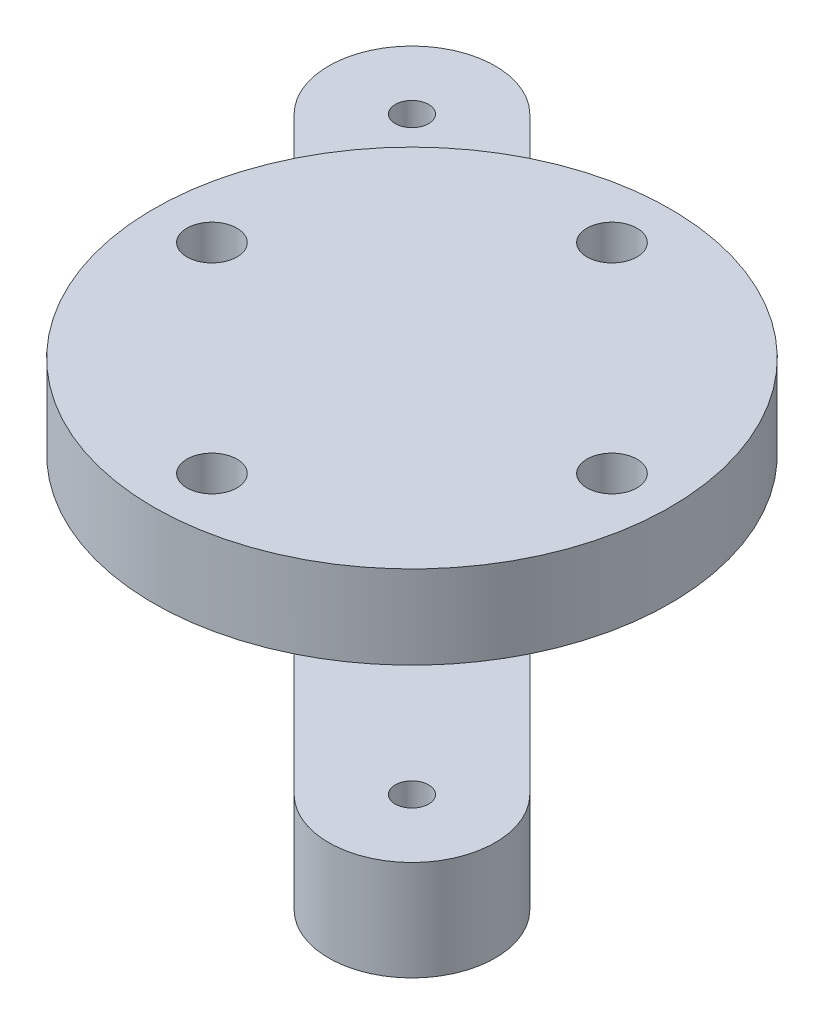
ISO-10303-21;
HEADER;
FILE_DESCRIPTION(('STEP AP214'),'2;1');
FILE_NAME('part.step','',(''),(''),'','','');
FILE_SCHEMA(('AUTOMOTIVE_DESIGN { 1 0 10303 214 1 1 1 1 }'));
ENDSEC;
DATA;
#1=APPLICATION_CONTEXT('core data for automotive mechanical design processes');
#2=APPLICATION_PROTOCOL_DEFINITION('international standard','automotive_design',2000,#1);
#3=PRODUCT_CONTEXT('',#1,'mechanical');
#4=PRODUCT('Part','Part','',(#3));
#5=PRODUCT_RELATED_PRODUCT_CATEGORY('part','',(#4));
#6=PRODUCT_DEFINITION_FORMATION('','',#4);
#7=PRODUCT_DEFINITION_CONTEXT('part definition',#1,'design');
#8=PRODUCT_DEFINITION('design','',#6,#7);
#9=PRODUCT_DEFINITION_SHAPE('','',#8);
#10=(LENGTH_UNIT() NAMED_UNIT(*) SI_UNIT(.MILLI.,.METRE.));
#11=(NAMED_UNIT(*) PLANE_ANGLE_UNIT() SI_UNIT($,.RADIAN.));
#12=(NAMED_UNIT(*) SI_UNIT($,.STERADIAN.) SOLID_ANGLE_UNIT());
#13=UNCERTAINTY_MEASURE_WITH_UNIT(LENGTH_MEASURE(1.E-05),#10,'distance_accuracy_value','');
#14=(GEOMETRIC_REPRESENTATION_CONTEXT(3) GLOBAL_UNCERTAINTY_ASSIGNED_CONTEXT((#13)) GLOBAL_UNIT_ASSIGNED_CONTEXT((#10,
#11,#12)) REPRESENTATION_CONTEXT('',''));
#15=CARTESIAN_POINT('',(0.,0.,0.));
#16=DIRECTION('',(0.,0.,1.));
#17=DIRECTION('',(1.,0.,0.));
#18=AXIS2_PLACEMENT_3D('',#15,#16,#17);
#19=CARTESIAN_POINT('',(0.,0.,0.));
#20=DIRECTION('',(0.,1.,0.));
#21=DIRECTION('',(0.,0.,1.));
#22=AXIS2_PLACEMENT_3D('',#19,#20,#21);
#23=PLANE('',#22);
#24=CARTESIAN_POINT('',(0.,0.,-24.));
#25=DIRECTION('',(0.,1.,0.));
#26=DIRECTION('',(0.,0.,1.));
#27=AXIS2_PLACEMENT_3D('',#24,#25,#26);
#28=CIRCLE('',#27,5.);
#29=CARTESIAN_POINT('',(0.,0.,-19.));
#30=VERTEX_POINT('',#29);
#31=EDGE_CURVE('E184',#30,#30,#28,.T.);
#32=ORIENTED_EDGE('',*,*,#31,.T.);
#33=EDGE_LOOP('',(#32));
#34=FACE_BOUND('',#33,.T.);
#35=CARTESIAN_POINT('',(24.,0.,0.));
#36=DIRECTION('',(0.,1.,0.));
#37=DIRECTION('',(0.,0.,1.));
#38=AXIS2_PLACEMENT_3D('',#35,#36,#37);
#39=CIRCLE('',#38,5.);
#40=CARTESIAN_POINT('',(24.,0.,5.));
#41=VERTEX_POINT('',#40);
#42=EDGE_CURVE('E176',#41,#41,#39,.T.);
#43=ORIENTED_EDGE('',*,*,#42,.T.);
#44=EDGE_LOOP('',(#43));
#45=FACE_BOUND('',#44,.T.);
#46=CARTESIAN_POINT('',(0.,0.,0.));
#47=DIRECTION('',(0.,1.,0.));
#48=DIRECTION('',(0.,0.,1.));
#49=AXIS2_PLACEMENT_3D('',#46,#47,#48);
#50=CIRCLE('',#49,31.);
#51=CARTESIAN_POINT('',(27.8195617331119,0.,13.677426109381));
#52=VERTEX_POINT('',#51);
#53=CARTESIAN_POINT('',(-13.6774261093809,0.,-27.8195617331119));
#54=VERTEX_POINT('',#53);
#55=EDGE_CURVE('E216',#52,#54,#50,.T.);
#56=ORIENTED_EDGE('',*,*,#55,.F.);
#57=DIRECTION('',(-0.707106781186547,0.,-0.707106781186547));
#58=VECTOR('',#57,1.);
#59=CARTESIAN_POINT('',(42.4264068711928,0.,28.2842712474619));
#60=LINE('',#59,#58);
#61=EDGE_CURVE('E11',#52,#54,#60,.T.);
#62=ORIENTED_EDGE('',*,*,#61,.T.);
#63=EDGE_LOOP('',(#56,#62));
#64=FACE_BOUND('',#63,.T.);
#65=ADVANCED_FACE('F45',(#34,#45,#64),#23,.F.);
#66=CARTESIAN_POINT('',(0.,10.,0.));
#67=DIRECTION('',(0.,-1.,0.));
#68=DIRECTION('',(0.,0.,-1.));
#69=AXIS2_PLACEMENT_3D('',#66,#67,#68);
#70=CYLINDRICAL_SURFACE('',#69,31.);
#71=CARTESIAN_POINT('',(0.,10.,0.));
#72=DIRECTION('',(0.,1.,0.));
#73=DIRECTION('',(0.,0.,1.));
#74=AXIS2_PLACEMENT_3D('',#71,#72,#73);
#75=CIRCLE('',#74,31.);
#76=CARTESIAN_POINT('',(0.,10.,31.));
#77=VERTEX_POINT('',#76);
#78=EDGE_CURVE('E208',#77,#77,#75,.T.);
#79=ORIENTED_EDGE('',*,*,#78,.F.);
#80=EDGE_LOOP('',(#79));
#81=FACE_BOUND('',#80,.T.);
#82=CARTESIAN_POINT('',(13.6774261093809,0.,27.8195617331119));
#83=VERTEX_POINT('',#82);
#84=EDGE_CURVE('E212',#83,#52,#50,.T.);
#85=ORIENTED_EDGE('',*,*,#84,.T.);
#86=ORIENTED_EDGE('',*,*,#55,.T.);
#87=CARTESIAN_POINT('',(-27.819561733112,0.,-13.6774261093808));
#88=VERTEX_POINT('',#87);
#89=EDGE_CURVE('E282',#54,#88,#50,.T.);
#90=ORIENTED_EDGE('',*,*,#89,.T.);
#91=EDGE_CURVE('E195',#88,#83,#50,.T.);
#92=ORIENTED_EDGE('',*,*,#91,.T.);
#93=EDGE_LOOP('',(#85,#86,#90,#92));
#94=FACE_BOUND('',#93,.T.);
#95=ADVANCED_FACE('F47',(#81,#94),#70,.T.);
#96=CARTESIAN_POINT('',(0.,10.,0.));
#97=DIRECTION('',(0.,1.,0.));
#98=DIRECTION('',(0.,0.,1.));
#99=AXIS2_PLACEMENT_3D('',#96,#97,#98);
#100=PLANE('',#99);
#101=CARTESIAN_POINT('',(24.,10.,0.));
#102=DIRECTION('',(0.,1.,0.));
#103=DIRECTION('',(0.,0.,1.));
#104=AXIS2_PLACEMENT_3D('',#101,#102,#103);
#105=CIRCLE('',#104,2.99999999999999);
#106=CARTESIAN_POINT('',(24.,10.,2.99999999999999));
#107=VERTEX_POINT('',#106);
#108=EDGE_CURVE('E191',#107,#107,#105,.T.);
#109=ORIENTED_EDGE('',*,*,#108,.F.);
#110=EDGE_LOOP('',(#109));
#111=FACE_BOUND('',#110,.T.);
#112=CARTESIAN_POINT('',(0.,10.,24.));
#113=DIRECTION('',(0.,1.,0.));
#114=DIRECTION('',(0.,0.,1.));
#115=AXIS2_PLACEMENT_3D('',#112,#113,#114);
#116=CIRCLE('',#115,3.);
#117=CARTESIAN_POINT('',(0.,10.,27.));
#118=VERTEX_POINT('',#117);
#119=EDGE_CURVE('E196',#118,#118,#116,.T.);
#120=ORIENTED_EDGE('',*,*,#119,.F.);
#121=EDGE_LOOP('',(#120));
#122=FACE_BOUND('',#121,.T.);
#123=CARTESIAN_POINT('',(-24.,10.,0.));
#124=DIRECTION('',(0.,1.,0.));
#125=DIRECTION('',(0.,0.,1.));
#126=AXIS2_PLACEMENT_3D('',#123,#124,#125);
#127=CIRCLE('',#126,3.);
#128=CARTESIAN_POINT('',(-24.,10.,3.));
#129=VERTEX_POINT('',#128);
#130=EDGE_CURVE('E200',#129,#129,#127,.T.);
#131=ORIENTED_EDGE('',*,*,#130,.F.);
#132=EDGE_LOOP('',(#131));
#133=FACE_BOUND('',#132,.T.);
#134=CARTESIAN_POINT('',(0.,10.,-24.));
#135=DIRECTION('',(0.,1.,0.));
#136=DIRECTION('',(0.,0.,1.));
#137=AXIS2_PLACEMENT_3D('',#134,#135,#136);
#138=CIRCLE('',#137,3.);
#139=CARTESIAN_POINT('',(0.,10.,-21.));
#140=VERTEX_POINT('',#139);
#141=EDGE_CURVE('E204',#140,#140,#138,.T.);
#142=ORIENTED_EDGE('',*,*,#141,.F.);
#143=EDGE_LOOP('',(#142));
#144=FACE_BOUND('',#143,.T.);
#145=ORIENTED_EDGE('',*,*,#78,.T.);
#146=EDGE_LOOP('',(#145));
#147=FACE_BOUND('',#146,.T.);
#148=ADVANCED_FACE('F259',(#111,#122,#133,#144,#147),#100,.T.);
#149=CARTESIAN_POINT('',(-24.,0.,0.));
#150=DIRECTION('',(0.,1.,0.));
#151=DIRECTION('',(0.,0.,1.));
#152=AXIS2_PLACEMENT_3D('',#149,#150,#151);
#153=CIRCLE('',#152,5.);
#154=CARTESIAN_POINT('',(-24.,0.,5.));
#155=VERTEX_POINT('',#154);
#156=EDGE_CURVE('E164',#155,#155,#153,.T.);
#157=ORIENTED_EDGE('',*,*,#156,.T.);
#158=EDGE_LOOP('',(#157));
#159=FACE_BOUND('',#158,.T.);
#160=CARTESIAN_POINT('',(0.,0.,24.));
#161=DIRECTION('',(0.,1.,0.));
#162=DIRECTION('',(0.,0.,1.));
#163=AXIS2_PLACEMENT_3D('',#160,#161,#162);
#164=CIRCLE('',#163,5.);
#165=CARTESIAN_POINT('',(0.,0.,29.));
#166=VERTEX_POINT('',#165);
#167=EDGE_CURVE('E168',#166,#166,#164,.T.);
#168=ORIENTED_EDGE('',*,*,#167,.T.);
#169=EDGE_LOOP('',(#168));
#170=FACE_BOUND('',#169,.T.);
#171=ORIENTED_EDGE('',*,*,#91,.F.);
#172=DIRECTION('',(0.707106781186549,0.,0.707106781186546));
#173=VECTOR('',#172,1.);
#174=CARTESIAN_POINT('',(28.2842712474619,0.,42.4264068711928));
#175=LINE('',#174,#173);
#176=EDGE_CURVE('E55',#88,#83,#175,.T.);
#177=ORIENTED_EDGE('',*,*,#176,.T.);
#178=EDGE_LOOP('',(#171,#177));
#179=FACE_BOUND('',#178,.T.);
#180=ADVANCED_FACE('F255',(#159,#170,#179),#23,.F.);
#181=CARTESIAN_POINT('',(0.,0.,-24.));
#182=DIRECTION('',(0.,1.,0.));
#183=DIRECTION('',(0.,0.,1.));
#184=AXIS2_PLACEMENT_3D('',#181,#182,#183);
#185=CYLINDRICAL_SURFACE('',#184,3.);
#186=CARTESIAN_POINT('',(0.,5.,-24.));
#187=DIRECTION('',(0.,1.,0.));
#188=DIRECTION('',(0.,0.,1.));
#189=AXIS2_PLACEMENT_3D('',#186,#187,#188);
#190=CIRCLE('',#189,3.);
#191=CARTESIAN_POINT('',(0.,5.,-21.));
#192=VERTEX_POINT('',#191);
#193=EDGE_CURVE('E49',#192,#192,#190,.F.);
#194=ORIENTED_EDGE('',*,*,#193,.T.);
#195=EDGE_LOOP('',(#194));
#196=FACE_BOUND('',#195,.T.);
#197=ORIENTED_EDGE('',*,*,#141,.T.);
#198=EDGE_LOOP('',(#197));
#199=FACE_BOUND('',#198,.T.);
#200=ADVANCED_FACE('F232',(#196,#199),#185,.F.);
#201=CARTESIAN_POINT('',(-24.,0.,0.));
#202=DIRECTION('',(0.,1.,0.));
#203=DIRECTION('',(0.,0.,1.));
#204=AXIS2_PLACEMENT_3D('',#201,#202,#203);
#205=CYLINDRICAL_SURFACE('',#204,3.);
#206=CARTESIAN_POINT('',(-24.,5.,0.));
#207=DIRECTION('',(0.,1.,0.));
#208=DIRECTION('',(0.,0.,1.));
#209=AXIS2_PLACEMENT_3D('',#206,#207,#208);
#210=CIRCLE('',#209,3.);
#211=CARTESIAN_POINT('',(-24.,5.,3.));
#212=VERTEX_POINT('',#211);
#213=EDGE_CURVE('E223',#212,#212,#210,.F.);
#214=ORIENTED_EDGE('',*,*,#213,.T.);
#215=EDGE_LOOP('',(#214));
#216=FACE_BOUND('',#215,.T.);
#217=ORIENTED_EDGE('',*,*,#130,.T.);
#218=EDGE_LOOP('',(#217));
#219=FACE_BOUND('',#218,.T.);
#220=ADVANCED_FACE('F269',(#216,#219),#205,.F.);
#221=CARTESIAN_POINT('',(0.,0.,24.));
#222=DIRECTION('',(0.,1.,0.));
#223=DIRECTION('',(0.,0.,1.));
#224=AXIS2_PLACEMENT_3D('',#221,#222,#223);
#225=CYLINDRICAL_SURFACE('',#224,3.);
#226=CARTESIAN_POINT('',(0.,5.,24.));
#227=DIRECTION('',(0.,1.,0.));
#228=DIRECTION('',(0.,0.,1.));
#229=AXIS2_PLACEMENT_3D('',#226,#227,#228);
#230=CIRCLE('',#229,3.);
#231=CARTESIAN_POINT('',(0.,5.,27.));
#232=VERTEX_POINT('',#231);
#233=EDGE_CURVE('E220',#232,#232,#230,.F.);
#234=ORIENTED_EDGE('',*,*,#233,.T.);
#235=EDGE_LOOP('',(#234));
#236=FACE_BOUND('',#235,.T.);
#237=ORIENTED_EDGE('',*,*,#119,.T.);
#238=EDGE_LOOP('',(#237));
#239=FACE_BOUND('',#238,.T.);
#240=ADVANCED_FACE('F353',(#236,#239),#225,.F.);
#241=CARTESIAN_POINT('',(24.,0.,0.));
#242=DIRECTION('',(0.,1.,0.));
#243=DIRECTION('',(0.,0.,1.));
#244=AXIS2_PLACEMENT_3D('',#241,#242,#243);
#245=CYLINDRICAL_SURFACE('',#244,2.99999999999999);
#246=CARTESIAN_POINT('',(24.,5.,0.));
#247=DIRECTION('',(0.,1.,0.));
#248=DIRECTION('',(0.,0.,1.));
#249=AXIS2_PLACEMENT_3D('',#246,#247,#248);
#250=CIRCLE('',#249,2.99999999999999);
#251=CARTESIAN_POINT('',(24.,5.,2.99999999999999));
#252=VERTEX_POINT('',#251);
#253=EDGE_CURVE('E163',#252,#252,#250,.F.);
#254=ORIENTED_EDGE('',*,*,#253,.T.);
#255=EDGE_LOOP('',(#254));
#256=FACE_BOUND('',#255,.T.);
#257=ORIENTED_EDGE('',*,*,#108,.T.);
#258=EDGE_LOOP('',(#257));
#259=FACE_BOUND('',#258,.T.);
#260=ADVANCED_FACE('F348',(#256,#259),#245,.F.);
#261=CARTESIAN_POINT('',(24.,5.,0.));
#262=DIRECTION('',(0.,1.,0.));
#263=DIRECTION('',(0.,0.,1.));
#264=AXIS2_PLACEMENT_3D('',#261,#262,#263);
#265=PLANE('',#264);
#266=CARTESIAN_POINT('',(24.,5.,0.));
#267=DIRECTION('',(0.,1.,0.));
#268=DIRECTION('',(0.,0.,1.));
#269=AXIS2_PLACEMENT_3D('',#266,#267,#268);
#270=CIRCLE('',#269,5.);
#271=CARTESIAN_POINT('',(24.,5.,5.));
#272=VERTEX_POINT('',#271);
#273=EDGE_CURVE('E180',#272,#272,#270,.T.);
#274=ORIENTED_EDGE('',*,*,#273,.F.);
#275=EDGE_LOOP('',(#274));
#276=FACE_BOUND('',#275,.T.);
#277=ORIENTED_EDGE('',*,*,#253,.F.);
#278=EDGE_LOOP('',(#277));
#279=FACE_BOUND('',#278,.T.);
#280=ADVANCED_FACE('F345',(#276,#279),#265,.F.);
#281=CARTESIAN_POINT('',(24.,5.,0.));
#282=DIRECTION('',(0.,-1.,0.));
#283=DIRECTION('',(0.,0.,-1.));
#284=AXIS2_PLACEMENT_3D('',#281,#282,#283);
#285=CYLINDRICAL_SURFACE('',#284,5.);
#286=ORIENTED_EDGE('',*,*,#273,.T.);
#287=EDGE_LOOP('',(#286));
#288=FACE_BOUND('',#287,.T.);
#289=ORIENTED_EDGE('',*,*,#42,.F.);
#290=EDGE_LOOP('',(#289));
#291=FACE_BOUND('',#290,.T.);
#292=ADVANCED_FACE('F341',(#288,#291),#285,.F.);
#293=CARTESIAN_POINT('',(0.,5.,24.));
#294=DIRECTION('',(0.,1.,0.));
#295=DIRECTION('',(0.,0.,1.));
#296=AXIS2_PLACEMENT_3D('',#293,#294,#295);
#297=PLANE('',#296);
#298=CARTESIAN_POINT('',(0.,5.,24.));
#299=DIRECTION('',(0.,1.,0.));
#300=DIRECTION('',(0.,0.,1.));
#301=AXIS2_PLACEMENT_3D('',#298,#299,#300);
#302=CIRCLE('',#301,5.);
#303=CARTESIAN_POINT('',(0.,5.,29.));
#304=VERTEX_POINT('',#303);
#305=EDGE_CURVE('E172',#304,#304,#302,.T.);
#306=ORIENTED_EDGE('',*,*,#305,.F.);
#307=EDGE_LOOP('',(#306));
#308=FACE_BOUND('',#307,.T.);
#309=ORIENTED_EDGE('',*,*,#233,.F.);
#310=EDGE_LOOP('',(#309));
#311=FACE_BOUND('',#310,.T.);
#312=ADVANCED_FACE('F337',(#308,#311),#297,.F.);
#313=CARTESIAN_POINT('',(0.,5.,24.));
#314=DIRECTION('',(0.,-1.,0.));
#315=DIRECTION('',(0.,0.,-1.));
#316=AXIS2_PLACEMENT_3D('',#313,#314,#315);
#317=CYLINDRICAL_SURFACE('',#316,5.);
#318=ORIENTED_EDGE('',*,*,#305,.T.);
#319=EDGE_LOOP('',(#318));
#320=FACE_BOUND('',#319,.T.);
#321=ORIENTED_EDGE('',*,*,#167,.F.);
#322=EDGE_LOOP('',(#321));
#323=FACE_BOUND('',#322,.T.);
#324=ADVANCED_FACE('F332',(#320,#323),#317,.F.);
#325=CARTESIAN_POINT('',(-24.,5.,0.));
#326=DIRECTION('',(0.,1.,0.));
#327=DIRECTION('',(0.,0.,1.));
#328=AXIS2_PLACEMENT_3D('',#325,#326,#327);
#329=PLANE('',#328);
#330=CARTESIAN_POINT('',(-24.,5.,0.));
#331=DIRECTION('',(0.,1.,0.));
#332=DIRECTION('',(0.,0.,1.));
#333=AXIS2_PLACEMENT_3D('',#330,#331,#332);
#334=CIRCLE('',#333,5.);
#335=CARTESIAN_POINT('',(-24.,5.,5.));
#336=VERTEX_POINT('',#335);
#337=EDGE_CURVE('E159',#336,#336,#334,.T.);
#338=ORIENTED_EDGE('',*,*,#337,.F.);
#339=EDGE_LOOP('',(#338));
#340=FACE_BOUND('',#339,.T.);
#341=ORIENTED_EDGE('',*,*,#213,.F.);
#342=EDGE_LOOP('',(#341));
#343=FACE_BOUND('',#342,.T.);
#344=ADVANCED_FACE('F248',(#340,#343),#329,.F.);
#345=CARTESIAN_POINT('',(-24.,5.,0.));
#346=DIRECTION('',(0.,-1.,0.));
#347=DIRECTION('',(0.,0.,-1.));
#348=AXIS2_PLACEMENT_3D('',#345,#346,#347);
#349=CYLINDRICAL_SURFACE('',#348,5.);
#350=ORIENTED_EDGE('',*,*,#337,.T.);
#351=EDGE_LOOP('',(#350));
#352=FACE_BOUND('',#351,.T.);
#353=ORIENTED_EDGE('',*,*,#156,.F.);
#354=EDGE_LOOP('',(#353));
#355=FACE_BOUND('',#354,.T.);
#356=ADVANCED_FACE('F238',(#352,#355),#349,.F.);
#357=CARTESIAN_POINT('',(0.,5.,-24.));
#358=DIRECTION('',(0.,1.,0.));
#359=DIRECTION('',(0.,0.,1.));
#360=AXIS2_PLACEMENT_3D('',#357,#358,#359);
#361=PLANE('',#360);
#362=CARTESIAN_POINT('',(0.,5.,-24.));
#363=DIRECTION('',(0.,1.,0.));
#364=DIRECTION('',(0.,0.,1.));
#365=AXIS2_PLACEMENT_3D('',#362,#363,#364);
#366=CIRCLE('',#365,5.);
#367=CARTESIAN_POINT('',(0.,5.,-19.));
#368=VERTEX_POINT('',#367);
#369=EDGE_CURVE('E153',#368,#368,#366,.T.);
#370=ORIENTED_EDGE('',*,*,#369,.F.);
#371=EDGE_LOOP('',(#370));
#372=FACE_BOUND('',#371,.T.);
#373=ORIENTED_EDGE('',*,*,#193,.F.);
#374=EDGE_LOOP('',(#373));
#375=FACE_BOUND('',#374,.T.);
#376=ADVANCED_FACE('F235',(#372,#375),#361,.F.);
#377=CARTESIAN_POINT('',(0.,5.,-24.));
#378=DIRECTION('',(0.,-1.,0.));
#379=DIRECTION('',(0.,0.,-1.));
#380=AXIS2_PLACEMENT_3D('',#377,#378,#379);
#381=CYLINDRICAL_SURFACE('',#380,5.);
#382=ORIENTED_EDGE('',*,*,#369,.T.);
#383=EDGE_LOOP('',(#382));
#384=FACE_BOUND('',#383,.T.);
#385=ORIENTED_EDGE('',*,*,#31,.F.);
#386=EDGE_LOOP('',(#385));
#387=FACE_BOUND('',#386,.T.);
#388=ADVANCED_FACE('F237',(#384,#387),#381,.F.);
#389=CARTESIAN_POINT('',(35.3553390593275,0.,35.3553390593272));
#390=DIRECTION('',(0.,1.,0.));
#391=DIRECTION('',(0.,0.,1.));
#392=AXIS2_PLACEMENT_3D('',#389,#390,#391);
#393=PLANE('',#392);
#394=CARTESIAN_POINT('',(35.3553390593276,0.,35.3553390593272));
#395=DIRECTION('',(0.,1.,0.));
#396=DIRECTION('',(0.,0.,1.));
#397=AXIS2_PLACEMENT_3D('',#394,#395,#396);
#398=CIRCLE('',#397,2.);
#399=CARTESIAN_POINT('',(35.3553390593276,0.,37.3553390593272));
#400=VERTEX_POINT('',#399);
#401=EDGE_CURVE('E306',#400,#400,#398,.T.);
#402=ORIENTED_EDGE('',*,*,#401,.F.);
#403=EDGE_LOOP('',(#402));
#404=FACE_BOUND('',#403,.T.);
#405=ORIENTED_EDGE('',*,*,#84,.F.);
#406=CARTESIAN_POINT('',(28.2842712474619,0.,42.4264068711928));
#407=VERTEX_POINT('',#406);
#408=EDGE_CURVE('E65',#83,#407,#175,.T.);
#409=ORIENTED_EDGE('',*,*,#408,.T.);
#410=CARTESIAN_POINT('',(35.3553390593275,0.,35.3553390593272));
#411=DIRECTION('',(0.,1.,0.));
#412=DIRECTION('',(0.,0.,1.));
#413=AXIS2_PLACEMENT_3D('',#410,#411,#412);
#414=CIRCLE('',#413,9.99999999999997);
#415=CARTESIAN_POINT('',(42.4264068711928,0.,28.2842712474619));
#416=VERTEX_POINT('',#415);
#417=EDGE_CURVE('E142',#407,#416,#414,.T.);
#418=ORIENTED_EDGE('',*,*,#417,.T.);
#419=EDGE_CURVE('E57',#416,#52,#60,.T.);
#420=ORIENTED_EDGE('',*,*,#419,.T.);
#421=EDGE_LOOP('',(#405,#409,#418,#420));
#422=FACE_BOUND('',#421,.T.);
#423=ADVANCED_FACE('F245',(#404,#422),#393,.T.);
#424=CARTESIAN_POINT('',(-35.3553390593275,0.,-35.3553390593272));
#425=DIRECTION('',(0.,1.,0.));
#426=DIRECTION('',(0.,0.,1.));
#427=AXIS2_PLACEMENT_3D('',#424,#425,#426);
#428=CIRCLE('',#427,2.);
#429=CARTESIAN_POINT('',(-35.3553390593275,0.,-33.3553390593272));
#430=VERTEX_POINT('',#429);
#431=EDGE_CURVE('E135',#430,#430,#428,.T.);
#432=ORIENTED_EDGE('',*,*,#431,.F.);
#433=EDGE_LOOP('',(#432));
#434=FACE_BOUND('',#433,.T.);
#435=ORIENTED_EDGE('',*,*,#89,.F.);
#436=CARTESIAN_POINT('',(-28.284271247462,0.,-42.4264068711927));
#437=VERTEX_POINT('',#436);
#438=EDGE_CURVE('E58',#54,#437,#60,.T.);
#439=ORIENTED_EDGE('',*,*,#438,.T.);
#440=CARTESIAN_POINT('',(-35.3553390593275,0.,-35.3553390593272));
#441=DIRECTION('',(0.,1.,0.));
#442=DIRECTION('',(0.,0.,1.));
#443=AXIS2_PLACEMENT_3D('',#440,#441,#442);
#444=CIRCLE('',#443,10.0000000000001);
#445=CARTESIAN_POINT('',(-42.426406871193,0.,-28.2842712474617));
#446=VERTEX_POINT('',#445);
#447=EDGE_CURVE('E147',#437,#446,#444,.T.);
#448=ORIENTED_EDGE('',*,*,#447,.T.);
#449=EDGE_CURVE('E130',#446,#88,#175,.T.);
#450=ORIENTED_EDGE('',*,*,#449,.T.);
#451=EDGE_LOOP('',(#435,#439,#448,#450));
#452=FACE_BOUND('',#451,.T.);
#453=ADVANCED_FACE('F314',(#434,#452),#393,.T.);
#454=CARTESIAN_POINT('',(35.3553390593275,-12.,35.3553390593272));
#455=DIRECTION('',(0.,1.,0.));
#456=DIRECTION('',(0.,0.,1.));
#457=AXIS2_PLACEMENT_3D('',#454,#455,#456);
#458=CYLINDRICAL_SURFACE('',#457,9.99999999999997);
#459=ORIENTED_EDGE('',*,*,#417,.F.);
#460=DIRECTION('',(0.,1.,0.));
#461=VECTOR('',#460,1.);
#462=CARTESIAN_POINT('',(28.2842712474619,-12.,42.4264068711928));
#463=LINE('',#462,#461);
#464=CARTESIAN_POINT('',(28.2842712474619,-12.,42.4264068711928));
#465=VERTEX_POINT('',#464);
#466=EDGE_CURVE('E128',#465,#407,#463,.T.);
#467=ORIENTED_EDGE('',*,*,#466,.F.);
#468=CARTESIAN_POINT('',(35.3553390593275,-12.,35.3553390593272));
#469=DIRECTION('',(0.,1.,0.));
#470=DIRECTION('',(0.,0.,1.));
#471=AXIS2_PLACEMENT_3D('',#468,#469,#470);
#472=CIRCLE('',#471,9.99999999999997);
#473=CARTESIAN_POINT('',(42.4264068711928,-12.,28.2842712474619));
#474=VERTEX_POINT('',#473);
#475=EDGE_CURVE('E121',#465,#474,#472,.T.);
#476=ORIENTED_EDGE('',*,*,#475,.T.);
#477=DIRECTION('',(0.,1.,0.));
#478=VECTOR('',#477,1.);
#479=CARTESIAN_POINT('',(42.4264068711928,-12.,28.2842712474619));
#480=LINE('',#479,#478);
#481=EDGE_CURVE('E102',#474,#416,#480,.T.);
#482=ORIENTED_EDGE('',*,*,#481,.T.);
#483=EDGE_LOOP('',(#459,#467,#476,#482));
#484=FACE_BOUND('',#483,.T.);
#485=ADVANCED_FACE('F127',(#484),#458,.T.);
#486=CARTESIAN_POINT('',(28.2842712474619,-12.,42.4264068711928));
#487=DIRECTION('',(-0.707106781186546,0.,0.707106781186549));
#488=DIRECTION('',(0.707106781186549,0.,0.707106781186546));
#489=AXIS2_PLACEMENT_3D('',#486,#487,#488);
#490=PLANE('',#489);
#491=ORIENTED_EDGE('',*,*,#449,.F.);
#492=DIRECTION('',(0.,1.,0.));
#493=VECTOR('',#492,1.);
#494=CARTESIAN_POINT('',(-42.426406871193,-12.,-28.2842712474617));
#495=LINE('',#494,#493);
#496=CARTESIAN_POINT('',(-42.426406871193,-12.,-28.2842712474617));
#497=VERTEX_POINT('',#496);
#498=EDGE_CURVE('E154',#497,#446,#495,.T.);
#499=ORIENTED_EDGE('',*,*,#498,.F.);
#500=DIRECTION('',(0.707106781186549,0.,0.707106781186546));
#501=VECTOR('',#500,1.);
#502=CARTESIAN_POINT('',(28.2842712474619,-12.,42.4264068711928));
#503=LINE('',#502,#501);
#504=EDGE_CURVE('E114',#497,#465,#503,.T.);
#505=ORIENTED_EDGE('',*,*,#504,.T.);
#506=ORIENTED_EDGE('',*,*,#466,.T.);
#507=ORIENTED_EDGE('',*,*,#408,.F.);
#508=ORIENTED_EDGE('',*,*,#176,.F.);
#509=EDGE_LOOP('',(#491,#499,#505,#506,#507,#508));
#510=FACE_BOUND('',#509,.T.);
#511=ADVANCED_FACE('F292',(#510),#490,.T.);
#512=CARTESIAN_POINT('',(-35.3553390593275,-12.,-35.3553390593272));
#513=DIRECTION('',(0.,1.,0.));
#514=DIRECTION('',(0.,0.,1.));
#515=AXIS2_PLACEMENT_3D('',#512,#513,#514);
#516=CYLINDRICAL_SURFACE('',#515,10.0000000000001);
#517=ORIENTED_EDGE('',*,*,#447,.F.);
#518=DIRECTION('',(0.,1.,0.));
#519=VECTOR('',#518,1.);
#520=CARTESIAN_POINT('',(-28.284271247462,-12.,-42.4264068711927));
#521=LINE('',#520,#519);
#522=CARTESIAN_POINT('',(-28.284271247462,-12.,-42.4264068711927));
#523=VERTEX_POINT('',#522);
#524=EDGE_CURVE('E113',#523,#437,#521,.T.);
#525=ORIENTED_EDGE('',*,*,#524,.F.);
#526=CARTESIAN_POINT('',(-35.3553390593275,-12.,-35.3553390593272));
#527=DIRECTION('',(0.,1.,0.));
#528=DIRECTION('',(0.,0.,1.));
#529=AXIS2_PLACEMENT_3D('',#526,#527,#528);
#530=CIRCLE('',#529,10.0000000000001);
#531=EDGE_CURVE('E124',#523,#497,#530,.T.);
#532=ORIENTED_EDGE('',*,*,#531,.T.);
#533=ORIENTED_EDGE('',*,*,#498,.T.);
#534=EDGE_LOOP('',(#517,#525,#532,#533));
#535=FACE_BOUND('',#534,.T.);
#536=ADVANCED_FACE('F295',(#535),#516,.T.);
#537=CARTESIAN_POINT('',(42.4264068711928,-12.,28.2842712474619));
#538=DIRECTION('',(0.707106781186547,0.,-0.707106781186548));
#539=DIRECTION('',(-0.707106781186548,0.,-0.707106781186547));
#540=AXIS2_PLACEMENT_3D('',#537,#538,#539);
#541=PLANE('',#540);
#542=ORIENTED_EDGE('',*,*,#419,.F.);
#543=ORIENTED_EDGE('',*,*,#481,.F.);
#544=DIRECTION('',(-0.707106781186547,0.,-0.707106781186547));
#545=VECTOR('',#544,1.);
#546=CARTESIAN_POINT('',(42.4264068711928,-12.,28.2842712474619));
#547=LINE('',#546,#545);
#548=EDGE_CURVE('E106',#474,#523,#547,.T.);
#549=ORIENTED_EDGE('',*,*,#548,.T.);
#550=ORIENTED_EDGE('',*,*,#524,.T.);
#551=ORIENTED_EDGE('',*,*,#438,.F.);
#552=ORIENTED_EDGE('',*,*,#61,.F.);
#553=EDGE_LOOP('',(#542,#543,#549,#550,#551,#552));
#554=FACE_BOUND('',#553,.T.);
#555=ADVANCED_FACE('F104',(#554),#541,.T.);
#556=CARTESIAN_POINT('',(35.3553390593275,-12.,35.3553390593272));
#557=DIRECTION('',(0.,1.,0.));
#558=DIRECTION('',(0.,0.,1.));
#559=AXIS2_PLACEMENT_3D('',#556,#557,#558);
#560=PLANE('',#559);
#561=CARTESIAN_POINT('',(35.3553390593276,-12.,35.3553390593272));
#562=DIRECTION('',(0.,1.,0.));
#563=DIRECTION('',(0.,0.,1.));
#564=AXIS2_PLACEMENT_3D('',#561,#562,#563);
#565=CIRCLE('',#564,2.);
#566=CARTESIAN_POINT('',(35.3553390593276,-12.,37.3553390593272));
#567=VERTEX_POINT('',#566);
#568=EDGE_CURVE('E303',#567,#567,#565,.T.);
#569=ORIENTED_EDGE('',*,*,#568,.T.);
#570=EDGE_LOOP('',(#569));
#571=FACE_BOUND('',#570,.T.);
#572=CARTESIAN_POINT('',(-35.3553390593275,-12.,-35.3553390593272));
#573=DIRECTION('',(0.,1.,0.));
#574=DIRECTION('',(0.,0.,1.));
#575=AXIS2_PLACEMENT_3D('',#572,#573,#574);
#576=CIRCLE('',#575,2.);
#577=CARTESIAN_POINT('',(-35.3553390593275,-12.,-33.3553390593272));
#578=VERTEX_POINT('',#577);
#579=EDGE_CURVE('E144',#578,#578,#576,.T.);
#580=ORIENTED_EDGE('',*,*,#579,.T.);
#581=EDGE_LOOP('',(#580));
#582=FACE_BOUND('',#581,.T.);
#583=ORIENTED_EDGE('',*,*,#475,.F.);
#584=ORIENTED_EDGE('',*,*,#504,.F.);
#585=ORIENTED_EDGE('',*,*,#531,.F.);
#586=ORIENTED_EDGE('',*,*,#548,.F.);
#587=EDGE_LOOP('',(#583,#584,#585,#586));
#588=FACE_BOUND('',#587,.T.);
#589=ADVANCED_FACE('F119',(#571,#582,#588),#560,.F.);
#590=CARTESIAN_POINT('',(-35.3553390593275,-12.,-35.3553390593272));
#591=DIRECTION('',(0.,1.,0.));
#592=DIRECTION('',(0.,0.,1.));
#593=AXIS2_PLACEMENT_3D('',#590,#591,#592);
#594=CYLINDRICAL_SURFACE('',#593,2.);
#595=ORIENTED_EDGE('',*,*,#579,.F.);
#596=EDGE_LOOP('',(#595));
#597=FACE_BOUND('',#596,.T.);
#598=ORIENTED_EDGE('',*,*,#431,.T.);
#599=EDGE_LOOP('',(#598));
#600=FACE_BOUND('',#599,.T.);
#601=ADVANCED_FACE('F478',(#597,#600),#594,.F.);
#602=CARTESIAN_POINT('',(35.3553390593276,-12.,35.3553390593272));
#603=DIRECTION('',(0.,1.,0.));
#604=DIRECTION('',(0.,0.,1.));
#605=AXIS2_PLACEMENT_3D('',#602,#603,#604);
#606=CYLINDRICAL_SURFACE('',#605,2.);
#607=ORIENTED_EDGE('',*,*,#568,.F.);
#608=EDGE_LOOP('',(#607));
#609=FACE_BOUND('',#608,.T.);
#610=ORIENTED_EDGE('',*,*,#401,.T.);
#611=EDGE_LOOP('',(#610));
#612=FACE_BOUND('',#611,.T.);
#613=ADVANCED_FACE('F312',(#609,#612),#606,.F.);
#614=CLOSED_SHELL('',(#65,#95,#148,#180,#200,#220,#240,#260,#280,#292,#312,#324,#344,#356,#376,
#388,#423,#453,#485,#511,#536,#555,#589,#601,#613));
#615=MANIFOLD_SOLID_BREP('B2',#614);
#616=ADVANCED_BREP_SHAPE_REPRESENTATION('',(#18,#615),#14);
#617=SHAPE_DEFINITION_REPRESENTATION(#9,#616);
ENDSEC;
END-ISO-10303-21;
